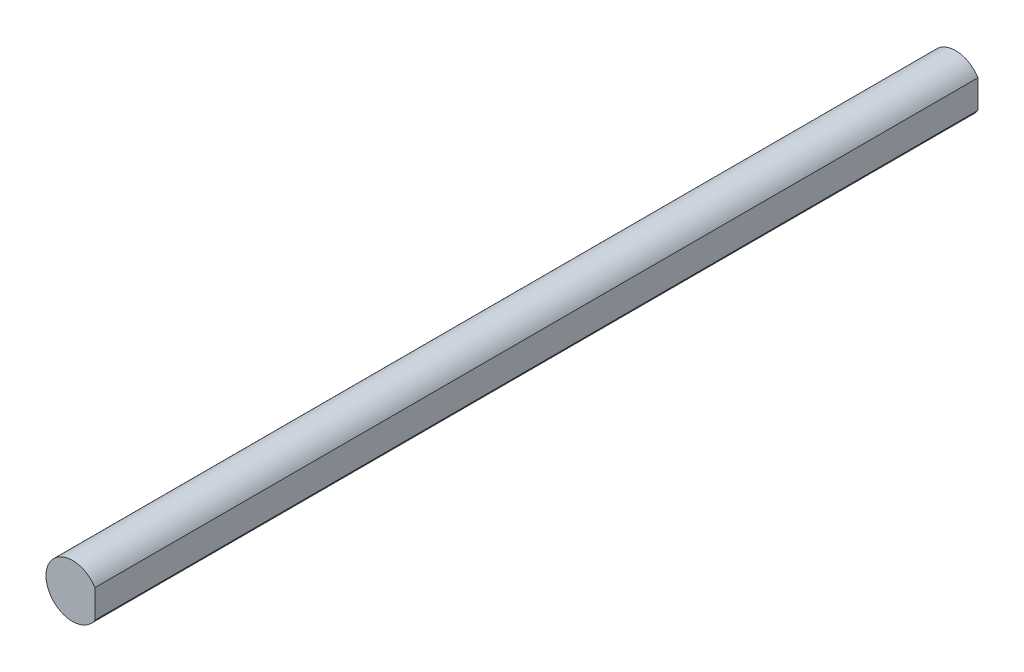
ISO-10303-21;
HEADER;
FILE_DESCRIPTION(('STEP AP214'),'2;1');
FILE_NAME('part.step','',(''),(''),'','','');
FILE_SCHEMA(('AUTOMOTIVE_DESIGN { 1 0 10303 214 1 1 1 1 }'));
ENDSEC;
DATA;
#1=APPLICATION_CONTEXT('core data for automotive mechanical design processes');
#2=APPLICATION_PROTOCOL_DEFINITION('international standard','automotive_design',2000,#1);
#3=PRODUCT_CONTEXT('',#1,'mechanical');
#4=PRODUCT('Part','Part','',(#3));
#5=PRODUCT_RELATED_PRODUCT_CATEGORY('part','',(#4));
#6=PRODUCT_DEFINITION_FORMATION('','',#4);
#7=PRODUCT_DEFINITION_CONTEXT('part definition',#1,'design');
#8=PRODUCT_DEFINITION('design','',#6,#7);
#9=PRODUCT_DEFINITION_SHAPE('','',#8);
#10=(LENGTH_UNIT() NAMED_UNIT(*) SI_UNIT(.MILLI.,.METRE.));
#11=(NAMED_UNIT(*) PLANE_ANGLE_UNIT() SI_UNIT($,.RADIAN.));
#12=(NAMED_UNIT(*) SI_UNIT($,.STERADIAN.) SOLID_ANGLE_UNIT());
#13=UNCERTAINTY_MEASURE_WITH_UNIT(LENGTH_MEASURE(1.E-05),#10,'distance_accuracy_value','');
#14=(GEOMETRIC_REPRESENTATION_CONTEXT(3) GLOBAL_UNCERTAINTY_ASSIGNED_CONTEXT((#13)) GLOBAL_UNIT_ASSIGNED_CONTEXT((#10,
#11,#12)) REPRESENTATION_CONTEXT('',''));
#15=CARTESIAN_POINT('',(0.,0.,0.));
#16=DIRECTION('',(0.,0.,1.));
#17=DIRECTION('',(1.,0.,0.));
#18=AXIS2_PLACEMENT_3D('',#15,#16,#17);
#19=CARTESIAN_POINT('',(0.,0.,100.));
#20=DIRECTION('',(0.,0.,-1.));
#21=DIRECTION('',(-1.,0.,0.));
#22=AXIS2_PLACEMENT_3D('',#19,#20,#21);
#23=CYLINDRICAL_SURFACE('',#22,3.);
#24=CARTESIAN_POINT('',(0.,0.,100.));
#25=DIRECTION('',(0.,0.,1.));
#26=DIRECTION('',(1.,0.,0.));
#27=AXIS2_PLACEMENT_3D('',#24,#25,#26);
#28=CIRCLE('',#27,3.);
#29=CARTESIAN_POINT('',(2.53999999999997,1.5963708842246,100.));
#30=VERTEX_POINT('',#29);
#31=CARTESIAN_POINT('',(2.53999999999999,-1.59637088422454,100.));
#32=VERTEX_POINT('',#31);
#33=EDGE_CURVE('E11',#30,#32,#28,.T.);
#34=ORIENTED_EDGE('',*,*,#33,.F.);
#35=DIRECTION('',(0.,0.,1.));
#36=VECTOR('',#35,1.);
#37=CARTESIAN_POINT('',(2.54000000000004,1.59637088422465,0.));
#38=LINE('',#37,#36);
#39=CARTESIAN_POINT('',(2.54000000000004,1.59637088422465,0.));
#40=VERTEX_POINT('',#39);
#41=EDGE_CURVE('E64',#40,#30,#38,.T.);
#42=ORIENTED_EDGE('',*,*,#41,.F.);
#43=CARTESIAN_POINT('',(0.,0.,0.));
#44=DIRECTION('',(0.,0.,1.));
#45=DIRECTION('',(1.,0.,0.));
#46=AXIS2_PLACEMENT_3D('',#43,#44,#45);
#47=CIRCLE('',#46,3.);
#48=CARTESIAN_POINT('',(2.54,-1.59637088422454,0.));
#49=VERTEX_POINT('',#48);
#50=EDGE_CURVE('E44',#40,#49,#47,.T.);
#51=ORIENTED_EDGE('',*,*,#50,.T.);
#52=DIRECTION('',(0.,0.,1.));
#53=VECTOR('',#52,1.);
#54=CARTESIAN_POINT('',(2.54,-1.59637088422454,0.));
#55=LINE('',#54,#53);
#56=EDGE_CURVE('E55',#49,#32,#55,.T.);
#57=ORIENTED_EDGE('',*,*,#56,.T.);
#58=EDGE_LOOP('',(#34,#42,#51,#57));
#59=FACE_BOUND('',#58,.T.);
#60=ADVANCED_FACE('F41',(#59),#23,.T.);
#61=CARTESIAN_POINT('',(0.,0.,100.));
#62=DIRECTION('',(0.,0.,1.));
#63=DIRECTION('',(1.,0.,0.));
#64=AXIS2_PLACEMENT_3D('',#61,#62,#63);
#65=PLANE('',#64);
#66=DIRECTION('',(0.,-1.,0.));
#67=VECTOR('',#66,1.);
#68=CARTESIAN_POINT('',(2.53999999999997,1.5963708842246,100.));
#69=LINE('',#68,#67);
#70=EDGE_CURVE('E67',#30,#32,#69,.T.);
#71=ORIENTED_EDGE('',*,*,#70,.F.);
#72=ORIENTED_EDGE('',*,*,#33,.T.);
#73=EDGE_LOOP('',(#71,#72));
#74=FACE_BOUND('',#73,.T.);
#75=ADVANCED_FACE('F74',(#74),#65,.T.);
#76=CARTESIAN_POINT('',(0.,0.,0.));
#77=DIRECTION('',(0.,0.,1.));
#78=DIRECTION('',(1.,0.,0.));
#79=AXIS2_PLACEMENT_3D('',#76,#77,#78);
#80=PLANE('',#79);
#81=ORIENTED_EDGE('',*,*,#50,.F.);
#82=DIRECTION('',(0.,-1.,0.));
#83=VECTOR('',#82,1.);
#84=CARTESIAN_POINT('',(2.54000000000004,1.59637088422465,0.));
#85=LINE('',#84,#83);
#86=EDGE_CURVE('E60',#40,#49,#85,.T.);
#87=ORIENTED_EDGE('',*,*,#86,.T.);
#88=EDGE_LOOP('',(#81,#87));
#89=FACE_BOUND('',#88,.T.);
#90=ADVANCED_FACE('F79',(#89),#80,.F.);
#91=CARTESIAN_POINT('',(2.54000000000004,1.59637088422465,0.));
#92=DIRECTION('',(-1.,0.,0.));
#93=DIRECTION('',(0.,0.,1.));
#94=AXIS2_PLACEMENT_3D('',#91,#92,#93);
#95=PLANE('',#94);
#96=ORIENTED_EDGE('',*,*,#70,.T.);
#97=ORIENTED_EDGE('',*,*,#56,.F.);
#98=ORIENTED_EDGE('',*,*,#86,.F.);
#99=ORIENTED_EDGE('',*,*,#41,.T.);
#100=EDGE_LOOP('',(#96,#97,#98,#99));
#101=FACE_BOUND('',#100,.T.);
#102=ADVANCED_FACE('F66',(#101),#95,.F.);
#103=CLOSED_SHELL('',(#60,#75,#90,#102));
#104=MANIFOLD_SOLID_BREP('B2',#103);
#105=ADVANCED_BREP_SHAPE_REPRESENTATION('',(#18,#104),#14);
#106=SHAPE_DEFINITION_REPRESENTATION(#9,#105);
ENDSEC;
END-ISO-10303-21;
